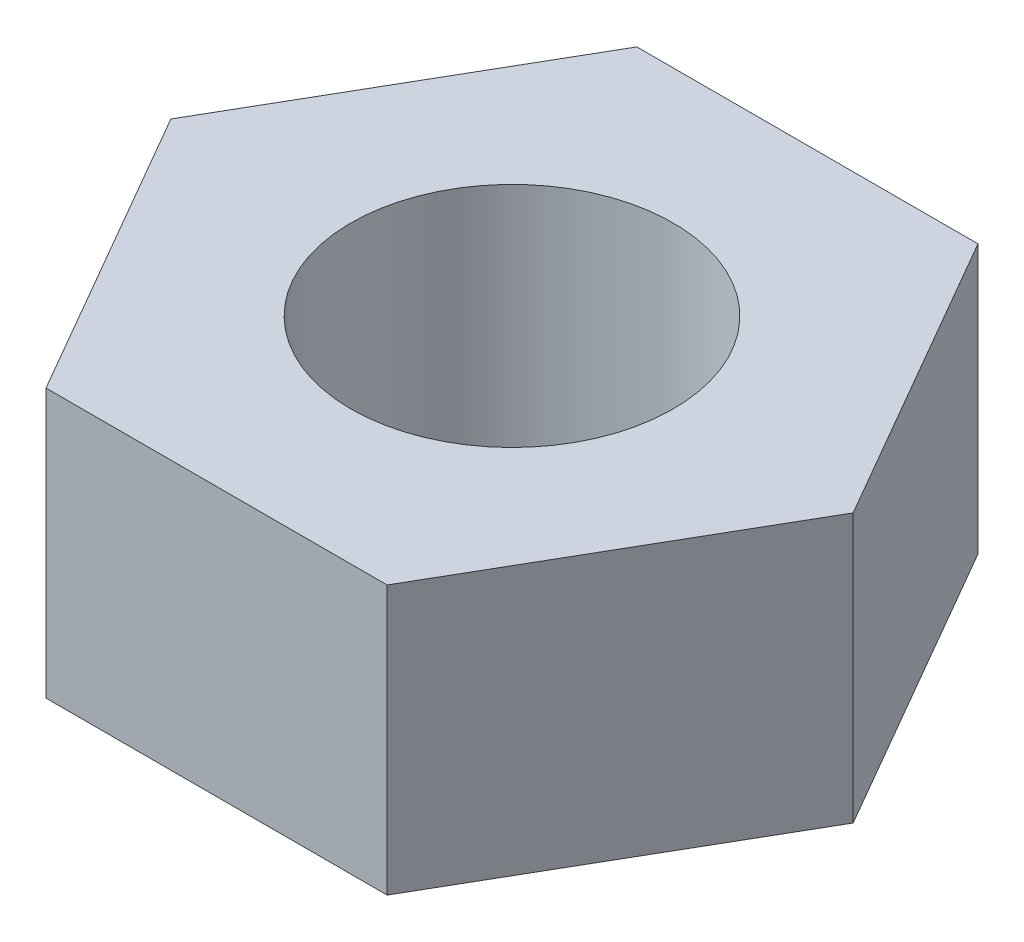
ISO-10303-21;
HEADER;
FILE_DESCRIPTION(('STEP AP214'),'2;1');
FILE_NAME('part.step','',(''),(''),'','','');
FILE_SCHEMA(('AUTOMOTIVE_DESIGN { 1 0 10303 214 1 1 1 1 }'));
ENDSEC;
DATA;
#1=APPLICATION_CONTEXT('core data for automotive mechanical design processes');
#2=APPLICATION_PROTOCOL_DEFINITION('international standard','automotive_design',2000,#1);
#3=PRODUCT_CONTEXT('',#1,'mechanical');
#4=PRODUCT('Part','Part','',(#3));
#5=PRODUCT_RELATED_PRODUCT_CATEGORY('part','',(#4));
#6=PRODUCT_DEFINITION_FORMATION('','',#4);
#7=PRODUCT_DEFINITION_CONTEXT('part definition',#1,'design');
#8=PRODUCT_DEFINITION('design','',#6,#7);
#9=PRODUCT_DEFINITION_SHAPE('','',#8);
#10=(LENGTH_UNIT() NAMED_UNIT(*) SI_UNIT(.MILLI.,.METRE.));
#11=(NAMED_UNIT(*) PLANE_ANGLE_UNIT() SI_UNIT($,.RADIAN.));
#12=(NAMED_UNIT(*) SI_UNIT($,.STERADIAN.) SOLID_ANGLE_UNIT());
#13=UNCERTAINTY_MEASURE_WITH_UNIT(LENGTH_MEASURE(1.E-05),#10,'distance_accuracy_value','');
#14=(GEOMETRIC_REPRESENTATION_CONTEXT(3) GLOBAL_UNCERTAINTY_ASSIGNED_CONTEXT((#13)) GLOBAL_UNIT_ASSIGNED_CONTEXT((#10,
#11,#12)) REPRESENTATION_CONTEXT('',''));
#15=CARTESIAN_POINT('',(0.,0.,0.));
#16=DIRECTION('',(0.,0.,1.));
#17=DIRECTION('',(1.,0.,0.));
#18=AXIS2_PLACEMENT_3D('',#15,#16,#17);
#19=CARTESIAN_POINT('',(0.,2.5,0.));
#20=DIRECTION('',(0.,1.,0.));
#21=DIRECTION('',(0.,0.,1.));
#22=AXIS2_PLACEMENT_3D('',#19,#20,#21);
#23=PLANE('',#22);
#24=DIRECTION('',(-0.5,0.,-0.866025403784439));
#25=VECTOR('',#24,1.);
#26=CARTESIAN_POINT('',(3.17542648054294,2.5,0.));
#27=LINE('',#26,#25);
#28=CARTESIAN_POINT('',(3.17542648054294,2.5,0.));
#29=VERTEX_POINT('',#28);
#30=CARTESIAN_POINT('',(1.58771324027147,2.5,-2.75));
#31=VERTEX_POINT('',#30);
#32=EDGE_CURVE('E146',#29,#31,#27,.T.);
#33=ORIENTED_EDGE('',*,*,#32,.T.);
#34=DIRECTION('',(-1.,0.,0.));
#35=VECTOR('',#34,1.);
#36=CARTESIAN_POINT('',(1.58771324027147,2.5,-2.75));
#37=LINE('',#36,#35);
#38=CARTESIAN_POINT('',(-1.58771324027147,2.5,-2.75));
#39=VERTEX_POINT('',#38);
#40=EDGE_CURVE('E94',#31,#39,#37,.T.);
#41=ORIENTED_EDGE('',*,*,#40,.T.);
#42=DIRECTION('',(-0.5,0.,0.866025403784439));
#43=VECTOR('',#42,1.);
#44=CARTESIAN_POINT('',(-1.58771324027147,2.5,-2.75));
#45=LINE('',#44,#43);
#46=CARTESIAN_POINT('',(-3.17542648054294,2.5,0.));
#47=VERTEX_POINT('',#46);
#48=EDGE_CURVE('E107',#39,#47,#45,.T.);
#49=ORIENTED_EDGE('',*,*,#48,.T.);
#50=DIRECTION('',(0.5,0.,0.866025403784438));
#51=VECTOR('',#50,1.);
#52=CARTESIAN_POINT('',(-3.17542648054294,2.5,0.));
#53=LINE('',#52,#51);
#54=CARTESIAN_POINT('',(-1.58771324027147,2.5,2.75));
#55=VERTEX_POINT('',#54);
#56=EDGE_CURVE('E101',#47,#55,#53,.T.);
#57=ORIENTED_EDGE('',*,*,#56,.T.);
#58=DIRECTION('',(1.,0.,0.));
#59=VECTOR('',#58,1.);
#60=CARTESIAN_POINT('',(-1.58771324027147,2.5,2.75));
#61=LINE('',#60,#59);
#62=CARTESIAN_POINT('',(1.58771324027147,2.5,2.75));
#63=VERTEX_POINT('',#62);
#64=EDGE_CURVE('E105',#55,#63,#61,.T.);
#65=ORIENTED_EDGE('',*,*,#64,.T.);
#66=DIRECTION('',(0.5,0.,-0.866025403784439));
#67=VECTOR('',#66,1.);
#68=CARTESIAN_POINT('',(1.58771324027147,2.5,2.75));
#69=LINE('',#68,#67);
#70=EDGE_CURVE('E57',#63,#29,#69,.T.);
#71=ORIENTED_EDGE('',*,*,#70,.T.);
#72=EDGE_LOOP('',(#33,#41,#49,#57,#65,#71));
#73=FACE_BOUND('',#72,.T.);
#74=CARTESIAN_POINT('',(0.,2.5,0.));
#75=DIRECTION('',(0.,1.,0.));
#76=DIRECTION('',(0.,0.,1.));
#77=AXIS2_PLACEMENT_3D('',#74,#75,#76);
#78=CIRCLE('',#77,1.5);
#79=CARTESIAN_POINT('',(0.,2.5,1.5));
#80=VERTEX_POINT('',#79);
#81=EDGE_CURVE('E134',#80,#80,#78,.T.);
#82=ORIENTED_EDGE('',*,*,#81,.F.);
#83=EDGE_LOOP('',(#82));
#84=FACE_BOUND('',#83,.T.);
#85=ADVANCED_FACE('F39',(#73,#84),#23,.T.);
#86=CARTESIAN_POINT('',(0.,0.,0.));
#87=DIRECTION('',(0.,1.,0.));
#88=DIRECTION('',(0.,0.,1.));
#89=AXIS2_PLACEMENT_3D('',#86,#87,#88);
#90=PLANE('',#89);
#91=DIRECTION('',(-0.5,0.,-0.866025403784439));
#92=VECTOR('',#91,1.);
#93=CARTESIAN_POINT('',(3.17542648054294,0.,0.));
#94=LINE('',#93,#92);
#95=CARTESIAN_POINT('',(3.17542648054294,0.,0.));
#96=VERTEX_POINT('',#95);
#97=CARTESIAN_POINT('',(1.58771324027147,0.,-2.75));
#98=VERTEX_POINT('',#97);
#99=EDGE_CURVE('E129',#96,#98,#94,.T.);
#100=ORIENTED_EDGE('',*,*,#99,.F.);
#101=DIRECTION('',(0.5,0.,-0.866025403784439));
#102=VECTOR('',#101,1.);
#103=CARTESIAN_POINT('',(1.58771324027147,0.,2.75));
#104=LINE('',#103,#102);
#105=CARTESIAN_POINT('',(1.58771324027147,0.,2.75));
#106=VERTEX_POINT('',#105);
#107=EDGE_CURVE('E86',#106,#96,#104,.T.);
#108=ORIENTED_EDGE('',*,*,#107,.F.);
#109=DIRECTION('',(1.,0.,0.));
#110=VECTOR('',#109,1.);
#111=CARTESIAN_POINT('',(-1.58771324027147,0.,2.75));
#112=LINE('',#111,#110);
#113=CARTESIAN_POINT('',(-1.58771324027147,0.,2.75));
#114=VERTEX_POINT('',#113);
#115=EDGE_CURVE('E80',#114,#106,#112,.T.);
#116=ORIENTED_EDGE('',*,*,#115,.F.);
#117=DIRECTION('',(0.5,0.,0.866025403784438));
#118=VECTOR('',#117,1.);
#119=CARTESIAN_POINT('',(-3.17542648054294,0.,0.));
#120=LINE('',#119,#118);
#121=CARTESIAN_POINT('',(-3.17542648054294,0.,0.));
#122=VERTEX_POINT('',#121);
#123=EDGE_CURVE('E116',#122,#114,#120,.T.);
#124=ORIENTED_EDGE('',*,*,#123,.F.);
#125=DIRECTION('',(-0.5,0.,0.866025403784439));
#126=VECTOR('',#125,1.);
#127=CARTESIAN_POINT('',(-1.58771324027147,0.,-2.75));
#128=LINE('',#127,#126);
#129=CARTESIAN_POINT('',(-1.58771324027147,0.,-2.75));
#130=VERTEX_POINT('',#129);
#131=EDGE_CURVE('E137',#130,#122,#128,.T.);
#132=ORIENTED_EDGE('',*,*,#131,.F.);
#133=DIRECTION('',(-1.,0.,0.));
#134=VECTOR('',#133,1.);
#135=CARTESIAN_POINT('',(1.58771324027147,0.,-2.75));
#136=LINE('',#135,#134);
#137=EDGE_CURVE('E133',#98,#130,#136,.T.);
#138=ORIENTED_EDGE('',*,*,#137,.F.);
#139=EDGE_LOOP('',(#100,#108,#116,#124,#132,#138));
#140=FACE_BOUND('',#139,.T.);
#141=CARTESIAN_POINT('',(0.,0.,0.));
#142=DIRECTION('',(0.,1.,0.));
#143=DIRECTION('',(0.,0.,1.));
#144=AXIS2_PLACEMENT_3D('',#141,#142,#143);
#145=CIRCLE('',#144,1.5);
#146=CARTESIAN_POINT('',(0.,0.,1.5));
#147=VERTEX_POINT('',#146);
#148=EDGE_CURVE('E243',#147,#147,#145,.T.);
#149=ORIENTED_EDGE('',*,*,#148,.T.);
#150=EDGE_LOOP('',(#149));
#151=FACE_BOUND('',#150,.T.);
#152=ADVANCED_FACE('F159',(#140,#151),#90,.F.);
#153=CARTESIAN_POINT('',(3.17542648054294,2.5,0.));
#154=DIRECTION('',(-0.866025403784438,0.,0.5));
#155=DIRECTION('',(0.5,0.,0.866025403784438));
#156=AXIS2_PLACEMENT_3D('',#153,#154,#155);
#157=PLANE('',#156);
#158=ORIENTED_EDGE('',*,*,#99,.T.);
#159=DIRECTION('',(0.,-1.,0.));
#160=VECTOR('',#159,1.);
#161=CARTESIAN_POINT('',(1.58771324027147,2.5,-2.75));
#162=LINE('',#161,#160);
#163=EDGE_CURVE('E11',#31,#98,#162,.T.);
#164=ORIENTED_EDGE('',*,*,#163,.F.);
#165=ORIENTED_EDGE('',*,*,#32,.F.);
#166=DIRECTION('',(0.,-1.,0.));
#167=VECTOR('',#166,1.);
#168=CARTESIAN_POINT('',(3.17542648054294,2.5,0.));
#169=LINE('',#168,#167);
#170=EDGE_CURVE('E125',#29,#96,#169,.T.);
#171=ORIENTED_EDGE('',*,*,#170,.T.);
#172=EDGE_LOOP('',(#158,#164,#165,#171));
#173=FACE_BOUND('',#172,.T.);
#174=ADVANCED_FACE('F41',(#173),#157,.F.);
#175=CARTESIAN_POINT('',(1.58771324027147,2.5,-2.75));
#176=DIRECTION('',(0.,0.,1.));
#177=DIRECTION('',(1.,0.,0.));
#178=AXIS2_PLACEMENT_3D('',#175,#176,#177);
#179=PLANE('',#178);
#180=ORIENTED_EDGE('',*,*,#137,.T.);
#181=DIRECTION('',(0.,-1.,0.));
#182=VECTOR('',#181,1.);
#183=CARTESIAN_POINT('',(-1.58771324027147,2.5,-2.75));
#184=LINE('',#183,#182);
#185=EDGE_CURVE('E49',#39,#130,#184,.T.);
#186=ORIENTED_EDGE('',*,*,#185,.F.);
#187=ORIENTED_EDGE('',*,*,#40,.F.);
#188=ORIENTED_EDGE('',*,*,#163,.T.);
#189=EDGE_LOOP('',(#180,#186,#187,#188));
#190=FACE_BOUND('',#189,.T.);
#191=ADVANCED_FACE('F184',(#190),#179,.F.);
#192=CARTESIAN_POINT('',(-1.58771324027147,2.5,-2.75));
#193=DIRECTION('',(0.866025403784439,0.,0.5));
#194=DIRECTION('',(0.5,0.,-0.866025403784439));
#195=AXIS2_PLACEMENT_3D('',#192,#193,#194);
#196=PLANE('',#195);
#197=ORIENTED_EDGE('',*,*,#131,.T.);
#198=DIRECTION('',(0.,-1.,0.));
#199=VECTOR('',#198,1.);
#200=CARTESIAN_POINT('',(-3.17542648054294,2.5,0.));
#201=LINE('',#200,#199);
#202=EDGE_CURVE('E118',#47,#122,#201,.T.);
#203=ORIENTED_EDGE('',*,*,#202,.F.);
#204=ORIENTED_EDGE('',*,*,#48,.F.);
#205=ORIENTED_EDGE('',*,*,#185,.T.);
#206=EDGE_LOOP('',(#197,#203,#204,#205));
#207=FACE_BOUND('',#206,.T.);
#208=ADVANCED_FACE('F156',(#207),#196,.F.);
#209=CARTESIAN_POINT('',(-3.17542648054294,2.5,0.));
#210=DIRECTION('',(0.866025403784438,0.,-0.5));
#211=DIRECTION('',(-0.5,0.,-0.866025403784438));
#212=AXIS2_PLACEMENT_3D('',#209,#210,#211);
#213=PLANE('',#212);
#214=ORIENTED_EDGE('',*,*,#123,.T.);
#215=DIRECTION('',(0.,-1.,0.));
#216=VECTOR('',#215,1.);
#217=CARTESIAN_POINT('',(-1.58771324027147,2.5,2.75));
#218=LINE('',#217,#216);
#219=EDGE_CURVE('E113',#55,#114,#218,.T.);
#220=ORIENTED_EDGE('',*,*,#219,.F.);
#221=ORIENTED_EDGE('',*,*,#56,.F.);
#222=ORIENTED_EDGE('',*,*,#202,.T.);
#223=EDGE_LOOP('',(#214,#220,#221,#222));
#224=FACE_BOUND('',#223,.T.);
#225=ADVANCED_FACE('F114',(#224),#213,.F.);
#226=CARTESIAN_POINT('',(-1.58771324027147,2.5,2.75));
#227=DIRECTION('',(0.,0.,-1.));
#228=DIRECTION('',(-1.,0.,0.));
#229=AXIS2_PLACEMENT_3D('',#226,#227,#228);
#230=PLANE('',#229);
#231=ORIENTED_EDGE('',*,*,#115,.T.);
#232=DIRECTION('',(0.,-1.,0.));
#233=VECTOR('',#232,1.);
#234=CARTESIAN_POINT('',(1.58771324027147,2.5,2.75));
#235=LINE('',#234,#233);
#236=EDGE_CURVE('E119',#63,#106,#235,.T.);
#237=ORIENTED_EDGE('',*,*,#236,.F.);
#238=ORIENTED_EDGE('',*,*,#64,.F.);
#239=ORIENTED_EDGE('',*,*,#219,.T.);
#240=EDGE_LOOP('',(#231,#237,#238,#239));
#241=FACE_BOUND('',#240,.T.);
#242=ADVANCED_FACE('F121',(#241),#230,.F.);
#243=CARTESIAN_POINT('',(1.58771324027147,2.5,2.75));
#244=DIRECTION('',(-0.866025403784439,0.,-0.5));
#245=DIRECTION('',(-0.5,0.,0.866025403784439));
#246=AXIS2_PLACEMENT_3D('',#243,#244,#245);
#247=PLANE('',#246);
#248=ORIENTED_EDGE('',*,*,#107,.T.);
#249=ORIENTED_EDGE('',*,*,#170,.F.);
#250=ORIENTED_EDGE('',*,*,#70,.F.);
#251=ORIENTED_EDGE('',*,*,#236,.T.);
#252=EDGE_LOOP('',(#248,#249,#250,#251));
#253=FACE_BOUND('',#252,.T.);
#254=ADVANCED_FACE('F164',(#253),#247,.F.);
#255=CARTESIAN_POINT('',(0.,2.5,0.));
#256=DIRECTION('',(0.,-1.,0.));
#257=DIRECTION('',(0.,0.,-1.));
#258=AXIS2_PLACEMENT_3D('',#255,#256,#257);
#259=CYLINDRICAL_SURFACE('',#258,1.5);
#260=ORIENTED_EDGE('',*,*,#81,.T.);
#261=EDGE_LOOP('',(#260));
#262=FACE_BOUND('',#261,.T.);
#263=ORIENTED_EDGE('',*,*,#148,.F.);
#264=EDGE_LOOP('',(#263));
#265=FACE_BOUND('',#264,.T.);
#266=ADVANCED_FACE('F166',(#262,#265),#259,.F.);
#267=CLOSED_SHELL('',(#85,#152,#174,#191,#208,#225,#242,#254,#266));
#268=MANIFOLD_SOLID_BREP('B2',#267);
#269=ADVANCED_BREP_SHAPE_REPRESENTATION('',(#18,#268),#14);
#270=SHAPE_DEFINITION_REPRESENTATION(#9,#269);
ENDSEC;
END-ISO-10303-21;
